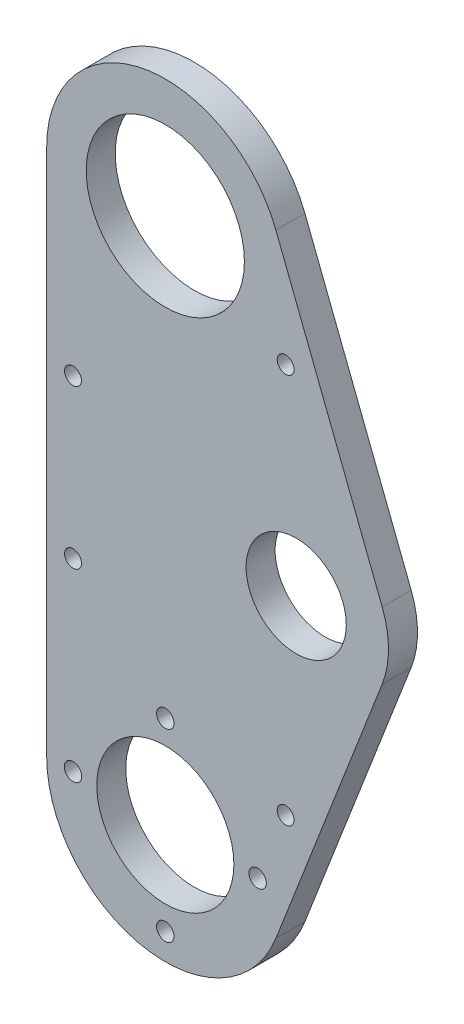
ISO-10303-21;
HEADER;
FILE_DESCRIPTION(('STEP AP214'),'2;1');
FILE_NAME('part.step','',(''),(''),'','','');
FILE_SCHEMA(('AUTOMOTIVE_DESIGN { 1 0 10303 214 1 1 1 1 }'));
ENDSEC;
DATA;
#1=APPLICATION_CONTEXT('core data for automotive mechanical design processes');
#2=APPLICATION_PROTOCOL_DEFINITION('international standard','automotive_design',2000,#1);
#3=PRODUCT_CONTEXT('',#1,'mechanical');
#4=PRODUCT('Part','Part','',(#3));
#5=PRODUCT_RELATED_PRODUCT_CATEGORY('part','',(#4));
#6=PRODUCT_DEFINITION_FORMATION('','',#4);
#7=PRODUCT_DEFINITION_CONTEXT('part definition',#1,'design');
#8=PRODUCT_DEFINITION('design','',#6,#7);
#9=PRODUCT_DEFINITION_SHAPE('','',#8);
#10=(LENGTH_UNIT() NAMED_UNIT(*) SI_UNIT(.MILLI.,.METRE.));
#11=(NAMED_UNIT(*) PLANE_ANGLE_UNIT() SI_UNIT($,.RADIAN.));
#12=(NAMED_UNIT(*) SI_UNIT($,.STERADIAN.) SOLID_ANGLE_UNIT());
#13=UNCERTAINTY_MEASURE_WITH_UNIT(LENGTH_MEASURE(1.E-05),#10,'distance_accuracy_value','');
#14=(GEOMETRIC_REPRESENTATION_CONTEXT(3) GLOBAL_UNCERTAINTY_ASSIGNED_CONTEXT((#13)) GLOBAL_UNIT_ASSIGNED_CONTEXT((#10,
#11,#12)) REPRESENTATION_CONTEXT('',''));
#15=CARTESIAN_POINT('',(0.,0.,0.));
#16=DIRECTION('',(0.,0.,1.));
#17=DIRECTION('',(1.,0.,0.));
#18=AXIS2_PLACEMENT_3D('',#15,#16,#17);
#19=CARTESIAN_POINT('',(0.,0.,2.75));
#20=DIRECTION('',(0.,0.,-1.));
#21=DIRECTION('',(-1.,0.,0.));
#22=AXIS2_PLACEMENT_3D('',#19,#20,#21);
#23=CYLINDRICAL_SURFACE('',#22,17.5);
#24=CARTESIAN_POINT('',(0.,0.,-2.75));
#25=DIRECTION('',(0.,0.,1.));
#26=DIRECTION('',(1.,0.,0.));
#27=AXIS2_PLACEMENT_3D('',#24,#25,#26);
#28=CIRCLE('',#27,17.5);
#29=CARTESIAN_POINT('',(16.3092785889385,-6.3448744596244,-2.75));
#30=VERTEX_POINT('',#29);
#31=CARTESIAN_POINT('',(16.3092785889385,6.3448744596244,-2.75));
#32=VERTEX_POINT('',#31);
#33=EDGE_CURVE('E107',#30,#32,#28,.T.);
#34=ORIENTED_EDGE('',*,*,#33,.T.);
#35=DIRECTION('',(0.,0.,-1.));
#36=VECTOR('',#35,1.);
#37=CARTESIAN_POINT('',(16.3092785889385,6.3448744596244,2.75));
#38=LINE('',#37,#36);
#39=CARTESIAN_POINT('',(16.3092785889385,6.3448744596244,2.75));
#40=VERTEX_POINT('',#39);
#41=EDGE_CURVE('E105',#40,#32,#38,.T.);
#42=ORIENTED_EDGE('',*,*,#41,.F.);
#43=CARTESIAN_POINT('',(0.,0.,2.75));
#44=DIRECTION('',(0.,0.,1.));
#45=DIRECTION('',(1.,0.,0.));
#46=AXIS2_PLACEMENT_3D('',#43,#44,#45);
#47=CIRCLE('',#46,17.5);
#48=CARTESIAN_POINT('',(16.3092785889385,-6.3448744596244,2.75));
#49=VERTEX_POINT('',#48);
#50=EDGE_CURVE('E95',#49,#40,#47,.T.);
#51=ORIENTED_EDGE('',*,*,#50,.F.);
#52=DIRECTION('',(0.,0.,-1.));
#53=VECTOR('',#52,1.);
#54=CARTESIAN_POINT('',(16.3092785889385,-6.3448744596244,2.75));
#55=LINE('',#54,#53);
#56=EDGE_CURVE('E174',#49,#30,#55,.T.);
#57=ORIENTED_EDGE('',*,*,#56,.T.);
#58=EDGE_LOOP('',(#34,#42,#51,#57));
#59=FACE_BOUND('',#58,.T.);
#60=ADVANCED_FACE('F35',(#59),#23,.T.);
#61=CARTESIAN_POINT('',(-47.3167765835794,0.,2.75));
#62=DIRECTION('',(1.,0.,0.));
#63=DIRECTION('',(0.,0.,-1.));
#64=AXIS2_PLACEMENT_3D('',#61,#62,#63);
#65=PLANE('',#64);
#66=DIRECTION('',(0.,-1.,0.));
#67=VECTOR('',#66,1.);
#68=CARTESIAN_POINT('',(-47.3167765835794,0.,-2.75));
#69=LINE('',#68,#67);
#70=CARTESIAN_POINT('',(-47.3167765835794,49.9999999999716,-2.75));
#71=VERTEX_POINT('',#70);
#72=CARTESIAN_POINT('',(-47.3167765835794,-49.9999999999716,-2.75));
#73=VERTEX_POINT('',#72);
#74=EDGE_CURVE('E176',#71,#73,#69,.T.);
#75=ORIENTED_EDGE('',*,*,#74,.T.);
#76=DIRECTION('',(0.,0.,-1.));
#77=VECTOR('',#76,1.);
#78=CARTESIAN_POINT('',(-47.3167765835794,-49.9999999999716,2.75));
#79=LINE('',#78,#77);
#80=CARTESIAN_POINT('',(-47.3167765835794,-49.9999999999716,2.75));
#81=VERTEX_POINT('',#80);
#82=EDGE_CURVE('E43',#81,#73,#79,.T.);
#83=ORIENTED_EDGE('',*,*,#82,.F.);
#84=DIRECTION('',(0.,-1.,0.));
#85=VECTOR('',#84,1.);
#86=CARTESIAN_POINT('',(-47.3167765835794,0.,2.75));
#87=LINE('',#86,#85);
#88=CARTESIAN_POINT('',(-47.3167765835794,49.9999999999716,2.75));
#89=VERTEX_POINT('',#88);
#90=EDGE_CURVE('E76',#89,#81,#87,.T.);
#91=ORIENTED_EDGE('',*,*,#90,.F.);
#92=DIRECTION('',(0.,0.,-1.));
#93=VECTOR('',#92,1.);
#94=CARTESIAN_POINT('',(-47.3167765835794,49.9999999999716,2.75));
#95=LINE('',#94,#93);
#96=EDGE_CURVE('E118',#89,#71,#95,.T.);
#97=ORIENTED_EDGE('',*,*,#96,.T.);
#98=EDGE_LOOP('',(#75,#83,#91,#97));
#99=FACE_BOUND('',#98,.T.);
#100=ADVANCED_FACE('F192',(#99),#65,.F.);
#101=CARTESIAN_POINT('',(-24.8167765835793,-49.9999999999716,2.75));
#102=DIRECTION('',(0.,0.,-1.));
#103=DIRECTION('',(-1.,0.,0.));
#104=AXIS2_PLACEMENT_3D('',#101,#102,#103);
#105=CYLINDRICAL_SURFACE('',#104,22.5);
#106=CARTESIAN_POINT('',(-24.8167765835793,-49.9999999999716,-2.75));
#107=DIRECTION('',(0.,0.,1.));
#108=DIRECTION('',(1.,0.,0.));
#109=AXIS2_PLACEMENT_3D('',#106,#107,#108);
#110=CIRCLE('',#109,22.5);
#111=CARTESIAN_POINT('',(-3.84770411208706,-58.1576957337744,-2.75));
#112=VERTEX_POINT('',#111);
#113=EDGE_CURVE('E66',#73,#112,#110,.T.);
#114=ORIENTED_EDGE('',*,*,#113,.T.);
#115=DIRECTION('',(0.,0.,-1.));
#116=VECTOR('',#115,1.);
#117=CARTESIAN_POINT('',(-3.84770411208706,-58.1576957337744,2.75));
#118=LINE('',#117,#116);
#119=CARTESIAN_POINT('',(-3.84770411208706,-58.1576957337744,2.75));
#120=VERTEX_POINT('',#119);
#121=EDGE_CURVE('E181',#120,#112,#118,.T.);
#122=ORIENTED_EDGE('',*,*,#121,.F.);
#123=CARTESIAN_POINT('',(-24.8167765835793,-49.9999999999716,2.75));
#124=DIRECTION('',(0.,0.,1.));
#125=DIRECTION('',(1.,0.,0.));
#126=AXIS2_PLACEMENT_3D('',#123,#124,#125);
#127=CIRCLE('',#126,22.5);
#128=EDGE_CURVE('E171',#81,#120,#127,.T.);
#129=ORIENTED_EDGE('',*,*,#128,.F.);
#130=ORIENTED_EDGE('',*,*,#82,.T.);
#131=EDGE_LOOP('',(#114,#122,#129,#130));
#132=FACE_BOUND('',#131,.T.);
#133=ADVANCED_FACE('F183',(#132),#105,.T.);
#134=CARTESIAN_POINT('',(16.3092785889385,-6.3448744596244,2.75));
#135=DIRECTION('',(-0.931958776510768,0.36256425483568,0.));
#136=DIRECTION('',(-0.36256425483568,-0.931958776510768,0.));
#137=AXIS2_PLACEMENT_3D('',#134,#135,#136);
#138=PLANE('',#137);
#139=DIRECTION('',(0.36256425483568,0.931958776510768,0.));
#140=VECTOR('',#139,1.);
#141=CARTESIAN_POINT('',(16.3092785889385,-6.3448744596244,-2.75));
#142=LINE('',#141,#140);
#143=EDGE_CURVE('E71',#112,#30,#142,.T.);
#144=ORIENTED_EDGE('',*,*,#143,.T.);
#145=ORIENTED_EDGE('',*,*,#56,.F.);
#146=DIRECTION('',(0.36256425483568,0.931958776510768,0.));
#147=VECTOR('',#146,1.);
#148=CARTESIAN_POINT('',(16.3092785889385,-6.3448744596244,2.75));
#149=LINE('',#148,#147);
#150=EDGE_CURVE('E51',#120,#49,#149,.T.);
#151=ORIENTED_EDGE('',*,*,#150,.F.);
#152=ORIENTED_EDGE('',*,*,#121,.T.);
#153=EDGE_LOOP('',(#144,#145,#151,#152));
#154=FACE_BOUND('',#153,.T.);
#155=ADVANCED_FACE('F198',(#154),#138,.F.);
#156=CARTESIAN_POINT('',(0.,0.,2.75));
#157=DIRECTION('',(0.,0.,1.));
#158=DIRECTION('',(1.,0.,0.));
#159=AXIS2_PLACEMENT_3D('',#156,#157,#158);
#160=PLANE('',#159);
#161=CARTESIAN_POINT('',(-42.3167765835793,15.,2.75));
#162=DIRECTION('',(0.,0.,1.));
#163=DIRECTION('',(1.,0.,0.));
#164=AXIS2_PLACEMENT_3D('',#161,#162,#163);
#165=CIRCLE('',#164,1.59999999999999);
#166=CARTESIAN_POINT('',(-40.7167765835794,15.,2.75));
#167=VERTEX_POINT('',#166);
#168=EDGE_CURVE('E264',#167,#167,#165,.T.);
#169=ORIENTED_EDGE('',*,*,#168,.F.);
#170=EDGE_LOOP('',(#169));
#171=FACE_BOUND('',#170,.T.);
#172=CARTESIAN_POINT('',(-42.3167765835793,-15.,2.75));
#173=DIRECTION('',(0.,0.,1.));
#174=DIRECTION('',(1.,0.,0.));
#175=AXIS2_PLACEMENT_3D('',#172,#173,#174);
#176=CIRCLE('',#175,1.6);
#177=CARTESIAN_POINT('',(-40.7167765835793,-15.,2.75));
#178=VERTEX_POINT('',#177);
#179=EDGE_CURVE('E270',#178,#178,#176,.T.);
#180=ORIENTED_EDGE('',*,*,#179,.F.);
#181=EDGE_LOOP('',(#180));
#182=FACE_BOUND('',#181,.T.);
#183=CARTESIAN_POINT('',(-24.8167765835794,49.9999999999716,2.75));
#184=DIRECTION('',(0.,0.,1.));
#185=DIRECTION('',(1.,0.,0.));
#186=AXIS2_PLACEMENT_3D('',#183,#184,#185);
#187=CIRCLE('',#186,15.);
#188=CARTESIAN_POINT('',(-9.81677658357935,49.9999999999716,2.75));
#189=VERTEX_POINT('',#188);
#190=EDGE_CURVE('E267',#189,#189,#187,.T.);
#191=ORIENTED_EDGE('',*,*,#190,.F.);
#192=EDGE_LOOP('',(#191));
#193=FACE_BOUND('',#192,.T.);
#194=CARTESIAN_POINT('',(-2.,37.,2.75));
#195=DIRECTION('',(0.,0.,-1.));
#196=DIRECTION('',(1.,0.,0.));
#197=AXIS2_PLACEMENT_3D('',#194,#195,#196);
#198=CIRCLE('',#197,1.59999999999999);
#199=CARTESIAN_POINT('',(-0.400000000000001,37.,2.75));
#200=VERTEX_POINT('',#199);
#201=EDGE_CURVE('E124',#200,#200,#198,.T.);
#202=ORIENTED_EDGE('',*,*,#201,.T.);
#203=EDGE_LOOP('',(#202));
#204=FACE_BOUND('',#203,.T.);
#205=CARTESIAN_POINT('',(-24.8167765835793,49.9999999999716,2.75));
#206=DIRECTION('',(0.,0.,-1.));
#207=DIRECTION('',(1.,0.,0.));
#208=AXIS2_PLACEMENT_3D('',#205,#206,#207);
#209=CIRCLE('',#208,22.5);
#210=CARTESIAN_POINT('',(-3.84770411208706,58.1576957337744,2.75));
#211=VERTEX_POINT('',#210);
#212=EDGE_CURVE('E115',#89,#211,#209,.T.);
#213=ORIENTED_EDGE('',*,*,#212,.F.);
#214=ORIENTED_EDGE('',*,*,#90,.T.);
#215=ORIENTED_EDGE('',*,*,#128,.T.);
#216=ORIENTED_EDGE('',*,*,#150,.T.);
#217=ORIENTED_EDGE('',*,*,#50,.T.);
#218=DIRECTION('',(0.36256425483568,-0.931958776510768,0.));
#219=VECTOR('',#218,1.);
#220=CARTESIAN_POINT('',(16.3092785889385,6.3448744596244,2.75));
#221=LINE('',#220,#219);
#222=EDGE_CURVE('E100',#211,#40,#221,.T.);
#223=ORIENTED_EDGE('',*,*,#222,.F.);
#224=EDGE_LOOP('',(#213,#214,#215,#216,#217,#223));
#225=FACE_BOUND('',#224,.T.);
#226=CARTESIAN_POINT('',(-2.,-37.,2.75));
#227=DIRECTION('',(0.,0.,1.));
#228=DIRECTION('',(1.,0.,0.));
#229=AXIS2_PLACEMENT_3D('',#226,#227,#228);
#230=CIRCLE('',#229,1.59999999999999);
#231=CARTESIAN_POINT('',(-0.400000000000001,-37.,2.75));
#232=VERTEX_POINT('',#231);
#233=EDGE_CURVE('E111',#232,#232,#230,.T.);
#234=ORIENTED_EDGE('',*,*,#233,.F.);
#235=EDGE_LOOP('',(#234));
#236=FACE_BOUND('',#235,.T.);
#237=CARTESIAN_POINT('',(-7.31677658359355,-50.,2.75));
#238=DIRECTION('',(0.,0.,1.));
#239=DIRECTION('',(0.,1.,0.));
#240=AXIS2_PLACEMENT_3D('',#237,#238,#239);
#241=CIRCLE('',#240,1.65);
#242=CARTESIAN_POINT('',(-7.31677658359355,-48.35,2.75));
#243=VERTEX_POINT('',#242);
#244=EDGE_CURVE('E142',#243,#243,#241,.T.);
#245=ORIENTED_EDGE('',*,*,#244,.F.);
#246=EDGE_LOOP('',(#245));
#247=FACE_BOUND('',#246,.T.);
#248=CARTESIAN_POINT('',(-24.8167765835936,-32.5,2.75));
#249=DIRECTION('',(0.,0.,1.));
#250=DIRECTION('',(-1.,0.,0.));
#251=AXIS2_PLACEMENT_3D('',#248,#249,#250);
#252=CIRCLE('',#251,1.65);
#253=CARTESIAN_POINT('',(-26.4667765835936,-32.5,2.75));
#254=VERTEX_POINT('',#253);
#255=EDGE_CURVE('E148',#254,#254,#252,.T.);
#256=ORIENTED_EDGE('',*,*,#255,.F.);
#257=EDGE_LOOP('',(#256));
#258=FACE_BOUND('',#257,.T.);
#259=CARTESIAN_POINT('',(-42.3167765835936,-50.0000000000002,2.75));
#260=DIRECTION('',(0.,0.,1.));
#261=DIRECTION('',(0.,-1.,0.));
#262=AXIS2_PLACEMENT_3D('',#259,#260,#261);
#263=CIRCLE('',#262,1.65);
#264=CARTESIAN_POINT('',(-42.3167765835936,-51.6500000000002,2.75));
#265=VERTEX_POINT('',#264);
#266=EDGE_CURVE('E135',#265,#265,#263,.T.);
#267=ORIENTED_EDGE('',*,*,#266,.F.);
#268=EDGE_LOOP('',(#267));
#269=FACE_BOUND('',#268,.T.);
#270=CARTESIAN_POINT('',(-24.8167765835936,-50.,2.75));
#271=DIRECTION('',(0.,0.,1.));
#272=DIRECTION('',(1.,0.,0.));
#273=AXIS2_PLACEMENT_3D('',#270,#271,#272);
#274=CIRCLE('',#273,13.);
#275=CARTESIAN_POINT('',(-11.8167765835936,-50.,2.75));
#276=VERTEX_POINT('',#275);
#277=EDGE_CURVE('E141',#276,#276,#274,.T.);
#278=ORIENTED_EDGE('',*,*,#277,.F.);
#279=EDGE_LOOP('',(#278));
#280=FACE_BOUND('',#279,.T.);
#281=CARTESIAN_POINT('',(-24.8167765835936,-67.5,2.75));
#282=DIRECTION('',(0.,0.,1.));
#283=DIRECTION('',(1.,0.,0.));
#284=AXIS2_PLACEMENT_3D('',#281,#282,#283);
#285=CIRCLE('',#284,1.65);
#286=CARTESIAN_POINT('',(-23.1667765835936,-67.5,2.75));
#287=VERTEX_POINT('',#286);
#288=EDGE_CURVE('E159',#287,#287,#285,.T.);
#289=ORIENTED_EDGE('',*,*,#288,.F.);
#290=EDGE_LOOP('',(#289));
#291=FACE_BOUND('',#290,.T.);
#292=CARTESIAN_POINT('',(0.,0.,2.75));
#293=DIRECTION('',(0.,0.,1.));
#294=DIRECTION('',(1.,0.,0.));
#295=AXIS2_PLACEMENT_3D('',#292,#293,#294);
#296=CIRCLE('',#295,9.49999999999999);
#297=CARTESIAN_POINT('',(9.5,0.,2.75));
#298=VERTEX_POINT('',#297);
#299=EDGE_CURVE('E165',#298,#298,#296,.T.);
#300=ORIENTED_EDGE('',*,*,#299,.F.);
#301=EDGE_LOOP('',(#300));
#302=FACE_BOUND('',#301,.T.);
#303=ADVANCED_FACE('F97',(#171,#182,#193,#204,#225,#236,#247,#258,#269,#280,#291,#302),#160,.T.);
#304=CARTESIAN_POINT('',(0.,0.,-2.75));
#305=DIRECTION('',(0.,0.,1.));
#306=DIRECTION('',(1.,0.,0.));
#307=AXIS2_PLACEMENT_3D('',#304,#305,#306);
#308=PLANE('',#307);
#309=CARTESIAN_POINT('',(-42.3167765835793,15.,-2.75));
#310=DIRECTION('',(0.,0.,1.));
#311=DIRECTION('',(1.,0.,0.));
#312=AXIS2_PLACEMENT_3D('',#309,#310,#311);
#313=CIRCLE('',#312,1.59999999999999);
#314=CARTESIAN_POINT('',(-40.7167765835794,15.,-2.75));
#315=VERTEX_POINT('',#314);
#316=EDGE_CURVE('E261',#315,#315,#313,.T.);
#317=ORIENTED_EDGE('',*,*,#316,.T.);
#318=EDGE_LOOP('',(#317));
#319=FACE_BOUND('',#318,.T.);
#320=CARTESIAN_POINT('',(-42.3167765835793,-15.,-2.75));
#321=DIRECTION('',(0.,0.,1.));
#322=DIRECTION('',(1.,0.,0.));
#323=AXIS2_PLACEMENT_3D('',#320,#321,#322);
#324=CIRCLE('',#323,1.6);
#325=CARTESIAN_POINT('',(-40.7167765835793,-15.,-2.75));
#326=VERTEX_POINT('',#325);
#327=EDGE_CURVE('E265',#326,#326,#324,.T.);
#328=ORIENTED_EDGE('',*,*,#327,.T.);
#329=EDGE_LOOP('',(#328));
#330=FACE_BOUND('',#329,.T.);
#331=CARTESIAN_POINT('',(-24.8167765835794,49.9999999999716,-2.75));
#332=DIRECTION('',(0.,0.,1.));
#333=DIRECTION('',(1.,0.,0.));
#334=AXIS2_PLACEMENT_3D('',#331,#332,#333);
#335=CIRCLE('',#334,15.);
#336=CARTESIAN_POINT('',(-9.81677658357935,49.9999999999716,-2.75));
#337=VERTEX_POINT('',#336);
#338=EDGE_CURVE('E275',#337,#337,#335,.T.);
#339=ORIENTED_EDGE('',*,*,#338,.T.);
#340=EDGE_LOOP('',(#339));
#341=FACE_BOUND('',#340,.T.);
#342=CARTESIAN_POINT('',(-2.,37.,-2.75));
#343=DIRECTION('',(0.,0.,-1.));
#344=DIRECTION('',(1.,0.,0.));
#345=AXIS2_PLACEMENT_3D('',#342,#343,#344);
#346=CIRCLE('',#345,1.59999999999999);
#347=CARTESIAN_POINT('',(-0.400000000000001,37.,-2.75));
#348=VERTEX_POINT('',#347);
#349=EDGE_CURVE('E127',#348,#348,#346,.T.);
#350=ORIENTED_EDGE('',*,*,#349,.F.);
#351=EDGE_LOOP('',(#350));
#352=FACE_BOUND('',#351,.T.);
#353=CARTESIAN_POINT('',(0.,0.,-2.75));
#354=DIRECTION('',(0.,0.,1.));
#355=DIRECTION('',(1.,0.,0.));
#356=AXIS2_PLACEMENT_3D('',#353,#354,#355);
#357=CIRCLE('',#356,9.49999999999999);
#358=CARTESIAN_POINT('',(9.5,0.,-2.75));
#359=VERTEX_POINT('',#358);
#360=EDGE_CURVE('E11',#359,#359,#357,.T.);
#361=ORIENTED_EDGE('',*,*,#360,.T.);
#362=EDGE_LOOP('',(#361));
#363=FACE_BOUND('',#362,.T.);
#364=ORIENTED_EDGE('',*,*,#74,.F.);
#365=CARTESIAN_POINT('',(-24.8167765835793,49.9999999999716,-2.75));
#366=DIRECTION('',(0.,0.,-1.));
#367=DIRECTION('',(1.,0.,0.));
#368=AXIS2_PLACEMENT_3D('',#365,#366,#367);
#369=CIRCLE('',#368,22.5);
#370=CARTESIAN_POINT('',(-3.84770411208706,58.1576957337744,-2.75));
#371=VERTEX_POINT('',#370);
#372=EDGE_CURVE('E116',#71,#371,#369,.T.);
#373=ORIENTED_EDGE('',*,*,#372,.T.);
#374=DIRECTION('',(0.36256425483568,-0.931958776510768,0.));
#375=VECTOR('',#374,1.);
#376=CARTESIAN_POINT('',(16.3092785889385,6.3448744596244,-2.75));
#377=LINE('',#376,#375);
#378=EDGE_CURVE('E121',#371,#32,#377,.T.);
#379=ORIENTED_EDGE('',*,*,#378,.T.);
#380=ORIENTED_EDGE('',*,*,#33,.F.);
#381=ORIENTED_EDGE('',*,*,#143,.F.);
#382=ORIENTED_EDGE('',*,*,#113,.F.);
#383=EDGE_LOOP('',(#364,#373,#379,#380,#381,#382));
#384=FACE_BOUND('',#383,.T.);
#385=CARTESIAN_POINT('',(-2.,-37.,-2.75));
#386=DIRECTION('',(0.,0.,1.));
#387=DIRECTION('',(1.,0.,0.));
#388=AXIS2_PLACEMENT_3D('',#385,#386,#387);
#389=CIRCLE('',#388,1.59999999999999);
#390=CARTESIAN_POINT('',(-0.400000000000001,-37.,-2.75));
#391=VERTEX_POINT('',#390);
#392=EDGE_CURVE('E132',#391,#391,#389,.T.);
#393=ORIENTED_EDGE('',*,*,#392,.T.);
#394=EDGE_LOOP('',(#393));
#395=FACE_BOUND('',#394,.T.);
#396=CARTESIAN_POINT('',(-7.31677658359355,-50.,-2.75));
#397=DIRECTION('',(0.,0.,1.));
#398=DIRECTION('',(0.,1.,0.));
#399=AXIS2_PLACEMENT_3D('',#396,#397,#398);
#400=CIRCLE('',#399,1.65);
#401=CARTESIAN_POINT('',(-7.31677658359355,-48.35,-2.75));
#402=VERTEX_POINT('',#401);
#403=EDGE_CURVE('E138',#402,#402,#400,.T.);
#404=ORIENTED_EDGE('',*,*,#403,.T.);
#405=EDGE_LOOP('',(#404));
#406=FACE_BOUND('',#405,.T.);
#407=CARTESIAN_POINT('',(-24.8167765835936,-32.5,-2.75));
#408=DIRECTION('',(0.,0.,1.));
#409=DIRECTION('',(-1.,0.,0.));
#410=AXIS2_PLACEMENT_3D('',#407,#408,#409);
#411=CIRCLE('',#410,1.65);
#412=CARTESIAN_POINT('',(-26.4667765835936,-32.5,-2.75));
#413=VERTEX_POINT('',#412);
#414=EDGE_CURVE('E145',#413,#413,#411,.T.);
#415=ORIENTED_EDGE('',*,*,#414,.T.);
#416=EDGE_LOOP('',(#415));
#417=FACE_BOUND('',#416,.T.);
#418=CARTESIAN_POINT('',(-42.3167765835936,-50.0000000000002,-2.75));
#419=DIRECTION('',(0.,0.,1.));
#420=DIRECTION('',(0.,-1.,0.));
#421=AXIS2_PLACEMENT_3D('',#418,#419,#420);
#422=CIRCLE('',#421,1.65);
#423=CARTESIAN_POINT('',(-42.3167765835936,-51.6500000000002,-2.75));
#424=VERTEX_POINT('',#423);
#425=EDGE_CURVE('E151',#424,#424,#422,.T.);
#426=ORIENTED_EDGE('',*,*,#425,.T.);
#427=EDGE_LOOP('',(#426));
#428=FACE_BOUND('',#427,.T.);
#429=CARTESIAN_POINT('',(-24.8167765835936,-50.,-2.75));
#430=DIRECTION('',(0.,0.,1.));
#431=DIRECTION('',(1.,0.,0.));
#432=AXIS2_PLACEMENT_3D('',#429,#430,#431);
#433=CIRCLE('',#432,13.);
#434=CARTESIAN_POINT('',(-11.8167765835936,-50.,-2.75));
#435=VERTEX_POINT('',#434);
#436=EDGE_CURVE('E156',#435,#435,#433,.T.);
#437=ORIENTED_EDGE('',*,*,#436,.T.);
#438=EDGE_LOOP('',(#437));
#439=FACE_BOUND('',#438,.T.);
#440=CARTESIAN_POINT('',(-24.8167765835936,-67.5,-2.75));
#441=DIRECTION('',(0.,0.,1.));
#442=DIRECTION('',(1.,0.,0.));
#443=AXIS2_PLACEMENT_3D('',#440,#441,#442);
#444=CIRCLE('',#443,1.65);
#445=CARTESIAN_POINT('',(-23.1667765835936,-67.5,-2.75));
#446=VERTEX_POINT('',#445);
#447=EDGE_CURVE('E162',#446,#446,#444,.T.);
#448=ORIENTED_EDGE('',*,*,#447,.T.);
#449=EDGE_LOOP('',(#448));
#450=FACE_BOUND('',#449,.T.);
#451=ADVANCED_FACE('F186',(#319,#330,#341,#352,#363,#384,#395,#406,#417,#428,#439,#450),#308,.F.);
#452=CARTESIAN_POINT('',(0.,0.,-2.75));
#453=DIRECTION('',(0.,0.,1.));
#454=DIRECTION('',(1.,0.,0.));
#455=AXIS2_PLACEMENT_3D('',#452,#453,#454);
#456=CYLINDRICAL_SURFACE('',#455,9.49999999999999);
#457=ORIENTED_EDGE('',*,*,#299,.T.);
#458=EDGE_LOOP('',(#457));
#459=FACE_BOUND('',#458,.T.);
#460=ORIENTED_EDGE('',*,*,#360,.F.);
#461=EDGE_LOOP('',(#460));
#462=FACE_BOUND('',#461,.T.);
#463=ADVANCED_FACE('F205',(#459,#462),#456,.F.);
#464=CARTESIAN_POINT('',(-24.8167765835936,-67.5,-2.75));
#465=DIRECTION('',(0.,0.,1.));
#466=DIRECTION('',(1.,0.,0.));
#467=AXIS2_PLACEMENT_3D('',#464,#465,#466);
#468=CYLINDRICAL_SURFACE('',#467,1.65);
#469=ORIENTED_EDGE('',*,*,#447,.F.);
#470=EDGE_LOOP('',(#469));
#471=FACE_BOUND('',#470,.T.);
#472=ORIENTED_EDGE('',*,*,#288,.T.);
#473=EDGE_LOOP('',(#472));
#474=FACE_BOUND('',#473,.T.);
#475=ADVANCED_FACE('F212',(#471,#474),#468,.F.);
#476=CARTESIAN_POINT('',(-24.8167765835936,-50.,-2.75));
#477=DIRECTION('',(0.,0.,1.));
#478=DIRECTION('',(1.,0.,0.));
#479=AXIS2_PLACEMENT_3D('',#476,#477,#478);
#480=CYLINDRICAL_SURFACE('',#479,13.);
#481=ORIENTED_EDGE('',*,*,#436,.F.);
#482=EDGE_LOOP('',(#481));
#483=FACE_BOUND('',#482,.T.);
#484=ORIENTED_EDGE('',*,*,#277,.T.);
#485=EDGE_LOOP('',(#484));
#486=FACE_BOUND('',#485,.T.);
#487=ADVANCED_FACE('F216',(#483,#486),#480,.F.);
#488=CARTESIAN_POINT('',(-42.3167765835936,-50.0000000000002,-2.75));
#489=DIRECTION('',(0.,0.,1.));
#490=DIRECTION('',(1.,0.,0.));
#491=AXIS2_PLACEMENT_3D('',#488,#489,#490);
#492=CYLINDRICAL_SURFACE('',#491,1.65);
#493=ORIENTED_EDGE('',*,*,#425,.F.);
#494=EDGE_LOOP('',(#493));
#495=FACE_BOUND('',#494,.T.);
#496=ORIENTED_EDGE('',*,*,#266,.T.);
#497=EDGE_LOOP('',(#496));
#498=FACE_BOUND('',#497,.T.);
#499=ADVANCED_FACE('F220',(#495,#498),#492,.F.);
#500=CARTESIAN_POINT('',(-24.8167765835936,-32.5,-2.75));
#501=DIRECTION('',(0.,0.,1.));
#502=DIRECTION('',(1.,0.,0.));
#503=AXIS2_PLACEMENT_3D('',#500,#501,#502);
#504=CYLINDRICAL_SURFACE('',#503,1.65);
#505=ORIENTED_EDGE('',*,*,#414,.F.);
#506=EDGE_LOOP('',(#505));
#507=FACE_BOUND('',#506,.T.);
#508=ORIENTED_EDGE('',*,*,#255,.T.);
#509=EDGE_LOOP('',(#508));
#510=FACE_BOUND('',#509,.T.);
#511=ADVANCED_FACE('F224',(#507,#510),#504,.F.);
#512=CARTESIAN_POINT('',(-7.31677658359355,-50.,-2.75));
#513=DIRECTION('',(0.,0.,1.));
#514=DIRECTION('',(1.,0.,0.));
#515=AXIS2_PLACEMENT_3D('',#512,#513,#514);
#516=CYLINDRICAL_SURFACE('',#515,1.65);
#517=ORIENTED_EDGE('',*,*,#403,.F.);
#518=EDGE_LOOP('',(#517));
#519=FACE_BOUND('',#518,.T.);
#520=ORIENTED_EDGE('',*,*,#244,.T.);
#521=EDGE_LOOP('',(#520));
#522=FACE_BOUND('',#521,.T.);
#523=ADVANCED_FACE('F228',(#519,#522),#516,.F.);
#524=CARTESIAN_POINT('',(-2.,-37.,-2.75));
#525=DIRECTION('',(0.,0.,1.));
#526=DIRECTION('',(1.,0.,0.));
#527=AXIS2_PLACEMENT_3D('',#524,#525,#526);
#528=CYLINDRICAL_SURFACE('',#527,1.59999999999999);
#529=ORIENTED_EDGE('',*,*,#392,.F.);
#530=EDGE_LOOP('',(#529));
#531=FACE_BOUND('',#530,.T.);
#532=ORIENTED_EDGE('',*,*,#233,.T.);
#533=EDGE_LOOP('',(#532));
#534=FACE_BOUND('',#533,.T.);
#535=ADVANCED_FACE('F232',(#531,#534),#528,.F.);
#536=CARTESIAN_POINT('',(16.3092785889385,6.3448744596244,2.75));
#537=DIRECTION('',(0.931958776510768,0.36256425483568,0.));
#538=DIRECTION('',(-0.36256425483568,0.931958776510768,0.));
#539=AXIS2_PLACEMENT_3D('',#536,#537,#538);
#540=PLANE('',#539);
#541=ORIENTED_EDGE('',*,*,#378,.F.);
#542=DIRECTION('',(0.,0.,-1.));
#543=VECTOR('',#542,1.);
#544=CARTESIAN_POINT('',(-3.84770411208706,58.1576957337744,2.75));
#545=LINE('',#544,#543);
#546=EDGE_CURVE('E112',#211,#371,#545,.T.);
#547=ORIENTED_EDGE('',*,*,#546,.F.);
#548=ORIENTED_EDGE('',*,*,#222,.T.);
#549=ORIENTED_EDGE('',*,*,#41,.T.);
#550=EDGE_LOOP('',(#541,#547,#548,#549));
#551=FACE_BOUND('',#550,.T.);
#552=ADVANCED_FACE('F114',(#551),#540,.T.);
#553=CARTESIAN_POINT('',(-24.8167765835793,49.9999999999716,2.75));
#554=DIRECTION('',(0.,0.,-1.));
#555=DIRECTION('',(-1.,0.,0.));
#556=AXIS2_PLACEMENT_3D('',#553,#554,#555);
#557=CYLINDRICAL_SURFACE('',#556,22.5);
#558=ORIENTED_EDGE('',*,*,#372,.F.);
#559=ORIENTED_EDGE('',*,*,#96,.F.);
#560=ORIENTED_EDGE('',*,*,#212,.T.);
#561=ORIENTED_EDGE('',*,*,#546,.T.);
#562=EDGE_LOOP('',(#558,#559,#560,#561));
#563=FACE_BOUND('',#562,.T.);
#564=ADVANCED_FACE('F191',(#563),#557,.T.);
#565=CARTESIAN_POINT('',(-2.,37.,-2.75));
#566=DIRECTION('',(0.,0.,1.));
#567=DIRECTION('',(1.,0.,0.));
#568=AXIS2_PLACEMENT_3D('',#565,#566,#567);
#569=CYLINDRICAL_SURFACE('',#568,1.59999999999999);
#570=ORIENTED_EDGE('',*,*,#349,.T.);
#571=EDGE_LOOP('',(#570));
#572=FACE_BOUND('',#571,.T.);
#573=ORIENTED_EDGE('',*,*,#201,.F.);
#574=EDGE_LOOP('',(#573));
#575=FACE_BOUND('',#574,.T.);
#576=ADVANCED_FACE('F241',(#572,#575),#569,.F.);
#577=CARTESIAN_POINT('',(-24.8167765835794,49.9999999999716,-2.75));
#578=DIRECTION('',(0.,0.,1.));
#579=DIRECTION('',(1.,0.,0.));
#580=AXIS2_PLACEMENT_3D('',#577,#578,#579);
#581=CYLINDRICAL_SURFACE('',#580,15.);
#582=ORIENTED_EDGE('',*,*,#338,.F.);
#583=EDGE_LOOP('',(#582));
#584=FACE_BOUND('',#583,.T.);
#585=ORIENTED_EDGE('',*,*,#190,.T.);
#586=EDGE_LOOP('',(#585));
#587=FACE_BOUND('',#586,.T.);
#588=ADVANCED_FACE('F244',(#584,#587),#581,.F.);
#589=CARTESIAN_POINT('',(-42.3167765835793,-15.,-2.75));
#590=DIRECTION('',(0.,0.,1.));
#591=DIRECTION('',(1.,0.,0.));
#592=AXIS2_PLACEMENT_3D('',#589,#590,#591);
#593=CYLINDRICAL_SURFACE('',#592,1.6);
#594=ORIENTED_EDGE('',*,*,#327,.F.);
#595=EDGE_LOOP('',(#594));
#596=FACE_BOUND('',#595,.T.);
#597=ORIENTED_EDGE('',*,*,#179,.T.);
#598=EDGE_LOOP('',(#597));
#599=FACE_BOUND('',#598,.T.);
#600=ADVANCED_FACE('F248',(#596,#599),#593,.F.);
#601=CARTESIAN_POINT('',(-42.3167765835793,15.,-2.75));
#602=DIRECTION('',(0.,0.,1.));
#603=DIRECTION('',(1.,0.,0.));
#604=AXIS2_PLACEMENT_3D('',#601,#602,#603);
#605=CYLINDRICAL_SURFACE('',#604,1.59999999999999);
#606=ORIENTED_EDGE('',*,*,#316,.F.);
#607=EDGE_LOOP('',(#606));
#608=FACE_BOUND('',#607,.T.);
#609=ORIENTED_EDGE('',*,*,#168,.T.);
#610=EDGE_LOOP('',(#609));
#611=FACE_BOUND('',#610,.T.);
#612=ADVANCED_FACE('F252',(#608,#611),#605,.F.);
#613=CLOSED_SHELL('',(#60,#100,#133,#155,#303,#451,#463,#475,#487,#499,#511,#523,#535,#552,#564,
#576,#588,#600,#612));
#614=MANIFOLD_SOLID_BREP('B2',#613);
#615=ADVANCED_BREP_SHAPE_REPRESENTATION('',(#18,#614),#14);
#616=SHAPE_DEFINITION_REPRESENTATION(#9,#615);
ENDSEC;
END-ISO-10303-21;
